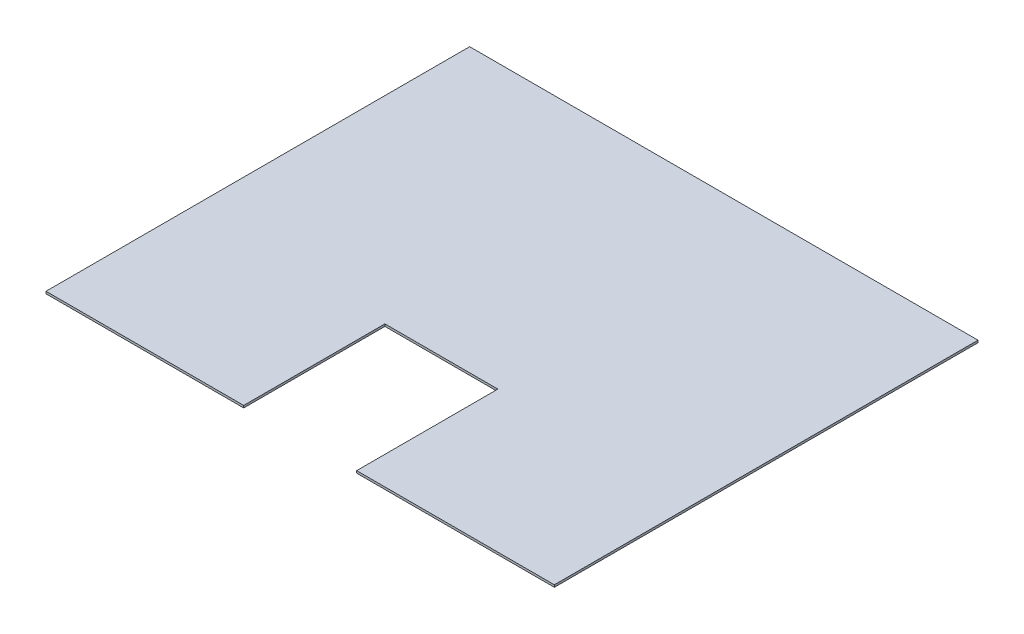
ISO-10303-21;
HEADER;
FILE_DESCRIPTION(('STEP AP214'),'2;1');
FILE_NAME('part.step','',(''),(''),'','','');
FILE_SCHEMA(('AUTOMOTIVE_DESIGN { 1 0 10303 214 1 1 1 1 }'));
ENDSEC;
DATA;
#1=APPLICATION_CONTEXT('core data for automotive mechanical design processes');
#2=APPLICATION_PROTOCOL_DEFINITION('international standard','automotive_design',2000,#1);
#3=PRODUCT_CONTEXT('',#1,'mechanical');
#4=PRODUCT('Part','Part','',(#3));
#5=PRODUCT_RELATED_PRODUCT_CATEGORY('part','',(#4));
#6=PRODUCT_DEFINITION_FORMATION('','',#4);
#7=PRODUCT_DEFINITION_CONTEXT('part definition',#1,'design');
#8=PRODUCT_DEFINITION('design','',#6,#7);
#9=PRODUCT_DEFINITION_SHAPE('','',#8);
#10=(LENGTH_UNIT() NAMED_UNIT(*) SI_UNIT(.MILLI.,.METRE.));
#11=(NAMED_UNIT(*) PLANE_ANGLE_UNIT() SI_UNIT($,.RADIAN.));
#12=(NAMED_UNIT(*) SI_UNIT($,.STERADIAN.) SOLID_ANGLE_UNIT());
#13=UNCERTAINTY_MEASURE_WITH_UNIT(LENGTH_MEASURE(1.E-05),#10,'distance_accuracy_value','');
#14=(GEOMETRIC_REPRESENTATION_CONTEXT(3) GLOBAL_UNCERTAINTY_ASSIGNED_CONTEXT((#13)) GLOBAL_UNIT_ASSIGNED_CONTEXT((#10,
#11,#12)) REPRESENTATION_CONTEXT('',''));
#15=CARTESIAN_POINT('',(0.,0.,0.));
#16=DIRECTION('',(0.,0.,1.));
#17=DIRECTION('',(1.,0.,0.));
#18=AXIS2_PLACEMENT_3D('',#15,#16,#17);
#19=CARTESIAN_POINT('',(-228.6,2.,190.5));
#20=DIRECTION('',(0.,0.,-1.));
#21=DIRECTION('',(-1.,0.,0.));
#22=AXIS2_PLACEMENT_3D('',#19,#20,#21);
#23=PLANE('',#22);
#24=DIRECTION('',(1.,0.,0.));
#25=VECTOR('',#24,1.);
#26=CARTESIAN_POINT('',(-228.6,0.,190.5));
#27=LINE('',#26,#25);
#28=CARTESIAN_POINT('',(-228.6,0.,190.5));
#29=VERTEX_POINT('',#28);
#30=CARTESIAN_POINT('',(-50.7999999999999,0.,190.5));
#31=VERTEX_POINT('',#30);
#32=EDGE_CURVE('E123',#29,#31,#27,.T.);
#33=ORIENTED_EDGE('',*,*,#32,.T.);
#34=DIRECTION('',(0.,1.,0.));
#35=VECTOR('',#34,1.);
#36=CARTESIAN_POINT('',(-50.7999999999999,0.,190.5));
#37=LINE('',#36,#35);
#38=CARTESIAN_POINT('',(-50.7999999999999,2.,190.5));
#39=VERTEX_POINT('',#38);
#40=EDGE_CURVE('E150',#31,#39,#37,.T.);
#41=ORIENTED_EDGE('',*,*,#40,.T.);
#42=DIRECTION('',(1.,0.,0.));
#43=VECTOR('',#42,1.);
#44=CARTESIAN_POINT('',(-228.6,2.,190.5));
#45=LINE('',#44,#43);
#46=CARTESIAN_POINT('',(-228.6,2.,190.5));
#47=VERTEX_POINT('',#46);
#48=EDGE_CURVE('E135',#47,#39,#45,.T.);
#49=ORIENTED_EDGE('',*,*,#48,.F.);
#50=DIRECTION('',(0.,-1.,0.));
#51=VECTOR('',#50,1.);
#52=CARTESIAN_POINT('',(-228.6,2.,190.5));
#53=LINE('',#52,#51);
#54=EDGE_CURVE('E134',#47,#29,#53,.T.);
#55=ORIENTED_EDGE('',*,*,#54,.T.);
#56=EDGE_LOOP('',(#33,#41,#49,#55));
#57=FACE_BOUND('',#56,.T.);
#58=ADVANCED_FACE('F34',(#57),#23,.F.);
#59=CARTESIAN_POINT('',(228.6,2.,-190.5));
#60=DIRECTION('',(-1.,0.,0.));
#61=DIRECTION('',(0.,0.,1.));
#62=AXIS2_PLACEMENT_3D('',#59,#60,#61);
#63=PLANE('',#62);
#64=DIRECTION('',(0.,0.,-1.));
#65=VECTOR('',#64,1.);
#66=CARTESIAN_POINT('',(228.6,0.,-190.5));
#67=LINE('',#66,#65);
#68=CARTESIAN_POINT('',(228.6,0.,190.5));
#69=VERTEX_POINT('',#68);
#70=CARTESIAN_POINT('',(228.6,0.,-190.5));
#71=VERTEX_POINT('',#70);
#72=EDGE_CURVE('E122',#69,#71,#67,.T.);
#73=ORIENTED_EDGE('',*,*,#72,.T.);
#74=DIRECTION('',(0.,-1.,0.));
#75=VECTOR('',#74,1.);
#76=CARTESIAN_POINT('',(228.6,2.,-190.5));
#77=LINE('',#76,#75);
#78=CARTESIAN_POINT('',(228.6,2.,-190.5));
#79=VERTEX_POINT('',#78);
#80=EDGE_CURVE('E11',#79,#71,#77,.T.);
#81=ORIENTED_EDGE('',*,*,#80,.F.);
#82=DIRECTION('',(0.,0.,-1.));
#83=VECTOR('',#82,1.);
#84=CARTESIAN_POINT('',(228.6,2.,-190.5));
#85=LINE('',#84,#83);
#86=CARTESIAN_POINT('',(228.6,2.,190.5));
#87=VERTEX_POINT('',#86);
#88=EDGE_CURVE('E127',#87,#79,#85,.T.);
#89=ORIENTED_EDGE('',*,*,#88,.F.);
#90=DIRECTION('',(0.,-1.,0.));
#91=VECTOR('',#90,1.);
#92=CARTESIAN_POINT('',(228.6,2.,190.5));
#93=LINE('',#92,#91);
#94=EDGE_CURVE('E132',#87,#69,#93,.T.);
#95=ORIENTED_EDGE('',*,*,#94,.T.);
#96=EDGE_LOOP('',(#73,#81,#89,#95));
#97=FACE_BOUND('',#96,.T.);
#98=ADVANCED_FACE('F36',(#97),#63,.F.);
#99=CARTESIAN_POINT('',(-228.6,2.,-190.5));
#100=DIRECTION('',(0.,0.,1.));
#101=DIRECTION('',(1.,0.,0.));
#102=AXIS2_PLACEMENT_3D('',#99,#100,#101);
#103=PLANE('',#102);
#104=DIRECTION('',(-1.,0.,0.));
#105=VECTOR('',#104,1.);
#106=CARTESIAN_POINT('',(-228.6,0.,-190.5));
#107=LINE('',#106,#105);
#108=CARTESIAN_POINT('',(-228.6,0.,-190.5));
#109=VERTEX_POINT('',#108);
#110=EDGE_CURVE('E128',#71,#109,#107,.T.);
#111=ORIENTED_EDGE('',*,*,#110,.T.);
#112=DIRECTION('',(0.,-1.,0.));
#113=VECTOR('',#112,1.);
#114=CARTESIAN_POINT('',(-228.6,2.,-190.5));
#115=LINE('',#114,#113);
#116=CARTESIAN_POINT('',(-228.6,2.,-190.5));
#117=VERTEX_POINT('',#116);
#118=EDGE_CURVE('E42',#117,#109,#115,.T.);
#119=ORIENTED_EDGE('',*,*,#118,.F.);
#120=DIRECTION('',(-1.,0.,0.));
#121=VECTOR('',#120,1.);
#122=CARTESIAN_POINT('',(-228.6,2.,-190.5));
#123=LINE('',#122,#121);
#124=EDGE_CURVE('E87',#79,#117,#123,.T.);
#125=ORIENTED_EDGE('',*,*,#124,.F.);
#126=ORIENTED_EDGE('',*,*,#80,.T.);
#127=EDGE_LOOP('',(#111,#119,#125,#126));
#128=FACE_BOUND('',#127,.T.);
#129=ADVANCED_FACE('F157',(#128),#103,.F.);
#130=CARTESIAN_POINT('',(-228.6,2.,-190.5));
#131=DIRECTION('',(1.,0.,0.));
#132=DIRECTION('',(0.,0.,-1.));
#133=AXIS2_PLACEMENT_3D('',#130,#131,#132);
#134=PLANE('',#133);
#135=DIRECTION('',(0.,0.,1.));
#136=VECTOR('',#135,1.);
#137=CARTESIAN_POINT('',(-228.6,0.,-190.5));
#138=LINE('',#137,#136);
#139=EDGE_CURVE('E124',#109,#29,#138,.T.);
#140=ORIENTED_EDGE('',*,*,#139,.T.);
#141=ORIENTED_EDGE('',*,*,#54,.F.);
#142=DIRECTION('',(0.,0.,1.));
#143=VECTOR('',#142,1.);
#144=CARTESIAN_POINT('',(-228.6,2.,-190.5));
#145=LINE('',#144,#143);
#146=EDGE_CURVE('E143',#117,#47,#145,.T.);
#147=ORIENTED_EDGE('',*,*,#146,.F.);
#148=ORIENTED_EDGE('',*,*,#118,.T.);
#149=EDGE_LOOP('',(#140,#141,#147,#148));
#150=FACE_BOUND('',#149,.T.);
#151=ADVANCED_FACE('F141',(#150),#134,.F.);
#152=CARTESIAN_POINT('',(50.8000000000001,2.,190.5));
#153=VERTEX_POINT('',#152);
#154=EDGE_CURVE('E58',#153,#87,#45,.T.);
#155=ORIENTED_EDGE('',*,*,#154,.F.);
#156=DIRECTION('',(0.,1.,0.));
#157=VECTOR('',#156,1.);
#158=CARTESIAN_POINT('',(50.8000000000001,0.,190.5));
#159=LINE('',#158,#157);
#160=CARTESIAN_POINT('',(50.8000000000001,0.,190.5));
#161=VERTEX_POINT('',#160);
#162=EDGE_CURVE('E111',#161,#153,#159,.T.);
#163=ORIENTED_EDGE('',*,*,#162,.F.);
#164=EDGE_CURVE('E80',#161,#69,#27,.T.);
#165=ORIENTED_EDGE('',*,*,#164,.T.);
#166=ORIENTED_EDGE('',*,*,#94,.F.);
#167=EDGE_LOOP('',(#155,#163,#165,#166));
#168=FACE_BOUND('',#167,.T.);
#169=ADVANCED_FACE('F116',(#168),#23,.F.);
#170=CARTESIAN_POINT('',(0.,2.,0.));
#171=DIRECTION('',(0.,1.,0.));
#172=DIRECTION('',(0.,0.,1.));
#173=AXIS2_PLACEMENT_3D('',#170,#171,#172);
#174=PLANE('',#173);
#175=DIRECTION('',(0.,0.,1.));
#176=VECTOR('',#175,1.);
#177=CARTESIAN_POINT('',(-50.7999999999999,2.,190.5));
#178=LINE('',#177,#176);
#179=CARTESIAN_POINT('',(-50.7999999999999,2.,63.5));
#180=VERTEX_POINT('',#179);
#181=EDGE_CURVE('E114',#180,#39,#178,.T.);
#182=ORIENTED_EDGE('',*,*,#181,.F.);
#183=DIRECTION('',(-1.,0.,0.));
#184=VECTOR('',#183,1.);
#185=CARTESIAN_POINT('',(-50.7999999999999,2.,63.5));
#186=LINE('',#185,#184);
#187=CARTESIAN_POINT('',(50.8000000000001,2.,63.5));
#188=VERTEX_POINT('',#187);
#189=EDGE_CURVE('E168',#188,#180,#186,.T.);
#190=ORIENTED_EDGE('',*,*,#189,.F.);
#191=DIRECTION('',(0.,0.,-1.));
#192=VECTOR('',#191,1.);
#193=CARTESIAN_POINT('',(50.8000000000001,2.,63.5));
#194=LINE('',#193,#192);
#195=EDGE_CURVE('E171',#153,#188,#194,.T.);
#196=ORIENTED_EDGE('',*,*,#195,.F.);
#197=ORIENTED_EDGE('',*,*,#154,.T.);
#198=ORIENTED_EDGE('',*,*,#88,.T.);
#199=ORIENTED_EDGE('',*,*,#124,.T.);
#200=ORIENTED_EDGE('',*,*,#146,.T.);
#201=ORIENTED_EDGE('',*,*,#48,.T.);
#202=EDGE_LOOP('',(#182,#190,#196,#197,#198,#199,#200,#201));
#203=FACE_BOUND('',#202,.T.);
#204=ADVANCED_FACE('F175',(#203),#174,.T.);
#205=CARTESIAN_POINT('',(0.,0.,0.));
#206=DIRECTION('',(0.,1.,0.));
#207=DIRECTION('',(0.,0.,1.));
#208=AXIS2_PLACEMENT_3D('',#205,#206,#207);
#209=PLANE('',#208);
#210=DIRECTION('',(-1.,0.,0.));
#211=VECTOR('',#210,1.);
#212=CARTESIAN_POINT('',(-50.7999999999999,0.,63.5));
#213=LINE('',#212,#211);
#214=CARTESIAN_POINT('',(50.8000000000001,0.,63.5));
#215=VERTEX_POINT('',#214);
#216=CARTESIAN_POINT('',(-50.7999999999999,0.,63.5));
#217=VERTEX_POINT('',#216);
#218=EDGE_CURVE('E49',#215,#217,#213,.T.);
#219=ORIENTED_EDGE('',*,*,#218,.T.);
#220=DIRECTION('',(0.,0.,1.));
#221=VECTOR('',#220,1.);
#222=CARTESIAN_POINT('',(-50.7999999999999,0.,190.5));
#223=LINE('',#222,#221);
#224=EDGE_CURVE('E117',#217,#31,#223,.T.);
#225=ORIENTED_EDGE('',*,*,#224,.T.);
#226=ORIENTED_EDGE('',*,*,#32,.F.);
#227=ORIENTED_EDGE('',*,*,#139,.F.);
#228=ORIENTED_EDGE('',*,*,#110,.F.);
#229=ORIENTED_EDGE('',*,*,#72,.F.);
#230=ORIENTED_EDGE('',*,*,#164,.F.);
#231=DIRECTION('',(0.,0.,-1.));
#232=VECTOR('',#231,1.);
#233=CARTESIAN_POINT('',(50.8000000000001,0.,63.5));
#234=LINE('',#233,#232);
#235=EDGE_CURVE('E108',#161,#215,#234,.T.);
#236=ORIENTED_EDGE('',*,*,#235,.T.);
#237=EDGE_LOOP('',(#219,#225,#226,#227,#228,#229,#230,#236));
#238=FACE_BOUND('',#237,.T.);
#239=ADVANCED_FACE('F120',(#238),#209,.F.);
#240=CARTESIAN_POINT('',(-50.7999999999999,0.,190.5));
#241=DIRECTION('',(-1.,0.,0.));
#242=DIRECTION('',(0.,0.,1.));
#243=AXIS2_PLACEMENT_3D('',#240,#241,#242);
#244=PLANE('',#243);
#245=ORIENTED_EDGE('',*,*,#181,.T.);
#246=ORIENTED_EDGE('',*,*,#40,.F.);
#247=ORIENTED_EDGE('',*,*,#224,.F.);
#248=DIRECTION('',(0.,1.,0.));
#249=VECTOR('',#248,1.);
#250=CARTESIAN_POINT('',(-50.7999999999999,0.,63.5));
#251=LINE('',#250,#249);
#252=EDGE_CURVE('E164',#217,#180,#251,.T.);
#253=ORIENTED_EDGE('',*,*,#252,.T.);
#254=EDGE_LOOP('',(#245,#246,#247,#253));
#255=FACE_BOUND('',#254,.T.);
#256=ADVANCED_FACE('F178',(#255),#244,.F.);
#257=CARTESIAN_POINT('',(-50.7999999999999,0.,63.5));
#258=DIRECTION('',(0.,0.,-1.));
#259=DIRECTION('',(-1.,0.,0.));
#260=AXIS2_PLACEMENT_3D('',#257,#258,#259);
#261=PLANE('',#260);
#262=ORIENTED_EDGE('',*,*,#189,.T.);
#263=ORIENTED_EDGE('',*,*,#252,.F.);
#264=ORIENTED_EDGE('',*,*,#218,.F.);
#265=DIRECTION('',(0.,1.,0.));
#266=VECTOR('',#265,1.);
#267=CARTESIAN_POINT('',(50.8000000000001,0.,63.5));
#268=LINE('',#267,#266);
#269=EDGE_CURVE('E112',#215,#188,#268,.T.);
#270=ORIENTED_EDGE('',*,*,#269,.T.);
#271=EDGE_LOOP('',(#262,#263,#264,#270));
#272=FACE_BOUND('',#271,.T.);
#273=ADVANCED_FACE('F176',(#272),#261,.F.);
#274=CARTESIAN_POINT('',(50.8000000000001,0.,63.5));
#275=DIRECTION('',(1.,0.,0.));
#276=DIRECTION('',(0.,0.,-1.));
#277=AXIS2_PLACEMENT_3D('',#274,#275,#276);
#278=PLANE('',#277);
#279=ORIENTED_EDGE('',*,*,#195,.T.);
#280=ORIENTED_EDGE('',*,*,#269,.F.);
#281=ORIENTED_EDGE('',*,*,#235,.F.);
#282=ORIENTED_EDGE('',*,*,#162,.T.);
#283=EDGE_LOOP('',(#279,#280,#281,#282));
#284=FACE_BOUND('',#283,.T.);
#285=ADVANCED_FACE('F110',(#284),#278,.F.);
#286=CLOSED_SHELL('',(#58,#98,#129,#151,#169,#204,#239,#256,#273,#285));
#287=MANIFOLD_SOLID_BREP('B2',#286);
#288=ADVANCED_BREP_SHAPE_REPRESENTATION('',(#18,#287),#14);
#289=SHAPE_DEFINITION_REPRESENTATION(#9,#288);
ENDSEC;
END-ISO-10303-21;
